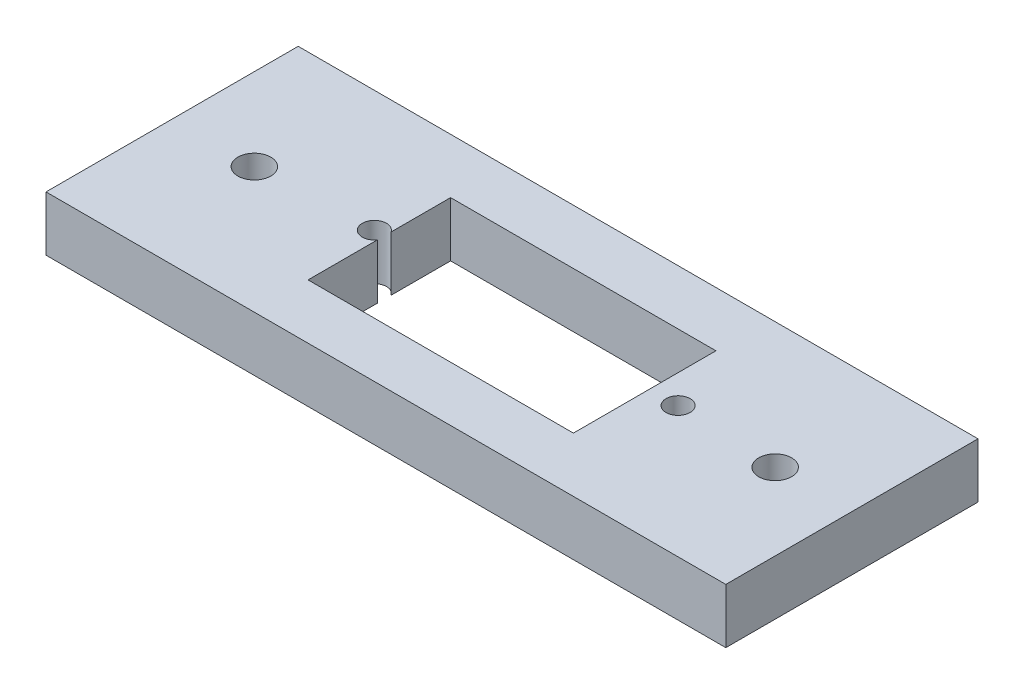
ISO-10303-21;
HEADER;
FILE_DESCRIPTION(('STEP AP214'),'2;1');
FILE_NAME('part.step','',(''),(''),'','','');
FILE_SCHEMA(('AUTOMOTIVE_DESIGN { 1 0 10303 214 1 1 1 1 }'));
ENDSEC;
DATA;
#1=APPLICATION_CONTEXT('core data for automotive mechanical design processes');
#2=APPLICATION_PROTOCOL_DEFINITION('international standard','automotive_design',2000,#1);
#3=PRODUCT_CONTEXT('',#1,'mechanical');
#4=PRODUCT('Part','Part','',(#3));
#5=PRODUCT_RELATED_PRODUCT_CATEGORY('part','',(#4));
#6=PRODUCT_DEFINITION_FORMATION('','',#4);
#7=PRODUCT_DEFINITION_CONTEXT('part definition',#1,'design');
#8=PRODUCT_DEFINITION('design','',#6,#7);
#9=PRODUCT_DEFINITION_SHAPE('','',#8);
#10=(LENGTH_UNIT() NAMED_UNIT(*) SI_UNIT(.MILLI.,.METRE.));
#11=(NAMED_UNIT(*) PLANE_ANGLE_UNIT() SI_UNIT($,.RADIAN.));
#12=(NAMED_UNIT(*) SI_UNIT($,.STERADIAN.) SOLID_ANGLE_UNIT());
#13=UNCERTAINTY_MEASURE_WITH_UNIT(LENGTH_MEASURE(1.E-05),#10,'distance_accuracy_value','');
#14=(GEOMETRIC_REPRESENTATION_CONTEXT(3) GLOBAL_UNCERTAINTY_ASSIGNED_CONTEXT((#13)) GLOBAL_UNIT_ASSIGNED_CONTEXT((#10,
#11,#12)) REPRESENTATION_CONTEXT('',''));
#15=CARTESIAN_POINT('',(0.,0.,0.));
#16=DIRECTION('',(0.,0.,1.));
#17=DIRECTION('',(1.,0.,0.));
#18=AXIS2_PLACEMENT_3D('',#15,#16,#17);
#19=CARTESIAN_POINT('',(18.9,5.,-18.));
#20=DIRECTION('',(1.,0.,0.));
#21=DIRECTION('',(0.,0.,-1.));
#22=AXIS2_PLACEMENT_3D('',#19,#20,#21);
#23=PLANE('',#22);
#24=DIRECTION('',(0.,1.,0.));
#25=VECTOR('',#24,1.);
#26=CARTESIAN_POINT('',(18.9,-5.,-12.5824555320338));
#27=LINE('',#26,#25);
#28=CARTESIAN_POINT('',(18.9,0.,-12.5824555320338));
#29=VERTEX_POINT('',#28);
#30=CARTESIAN_POINT('',(18.9,5.,-12.5824555320338));
#31=VERTEX_POINT('',#30);
#32=EDGE_CURVE('E11',#29,#31,#27,.T.);
#33=ORIENTED_EDGE('',*,*,#32,.F.);
#34=DIRECTION('',(0.,0.,1.));
#35=VECTOR('',#34,1.);
#36=CARTESIAN_POINT('',(18.9,0.,-18.));
#37=LINE('',#36,#35);
#38=CARTESIAN_POINT('',(18.9,0.,-18.));
#39=VERTEX_POINT('',#38);
#40=EDGE_CURVE('E162',#39,#29,#37,.T.);
#41=ORIENTED_EDGE('',*,*,#40,.F.);
#42=DIRECTION('',(0.,-1.,0.));
#43=VECTOR('',#42,1.);
#44=CARTESIAN_POINT('',(18.9,5.,-18.));
#45=LINE('',#44,#43);
#46=CARTESIAN_POINT('',(18.9,5.,-18.));
#47=VERTEX_POINT('',#46);
#48=EDGE_CURVE('E141',#47,#39,#45,.T.);
#49=ORIENTED_EDGE('',*,*,#48,.F.);
#50=DIRECTION('',(0.,0.,1.));
#51=VECTOR('',#50,1.);
#52=CARTESIAN_POINT('',(18.9,5.,-18.));
#53=LINE('',#52,#51);
#54=EDGE_CURVE('E134',#47,#31,#53,.T.);
#55=ORIENTED_EDGE('',*,*,#54,.T.);
#56=EDGE_LOOP('',(#33,#41,#49,#55));
#57=FACE_BOUND('',#56,.T.);
#58=ADVANCED_FACE('F45',(#57),#23,.T.);
#59=CARTESIAN_POINT('',(0.,5.,0.));
#60=DIRECTION('',(0.,-1.,0.));
#61=DIRECTION('',(0.,0.,-1.));
#62=AXIS2_PLACEMENT_3D('',#59,#60,#61);
#63=PLANE('',#62);
#64=CARTESIAN_POINT('',(55.,5.,-11.5));
#65=DIRECTION('',(0.,1.,0.));
#66=DIRECTION('',(0.,0.,1.));
#67=AXIS2_PLACEMENT_3D('',#64,#65,#66);
#68=CIRCLE('',#67,1.5);
#69=CARTESIAN_POINT('',(55.,5.,-9.99999999999999));
#70=VERTEX_POINT('',#69);
#71=EDGE_CURVE('E393',#70,#70,#68,.T.);
#72=ORIENTED_EDGE('',*,*,#71,.F.);
#73=EDGE_LOOP('',(#72));
#74=FACE_BOUND('',#73,.T.);
#75=CARTESIAN_POINT('',(7.5,5.,-11.5));
#76=DIRECTION('',(0.,1.,0.));
#77=DIRECTION('',(0.,0.,1.));
#78=AXIS2_PLACEMENT_3D('',#75,#76,#77);
#79=CIRCLE('',#78,1.5);
#80=CARTESIAN_POINT('',(7.5,5.,-10.));
#81=VERTEX_POINT('',#80);
#82=EDGE_CURVE('E138',#81,#81,#79,.T.);
#83=ORIENTED_EDGE('',*,*,#82,.F.);
#84=EDGE_LOOP('',(#83));
#85=FACE_BOUND('',#84,.T.);
#86=CARTESIAN_POINT('',(45.7000000000002,5.,-11.9499999999999));
#87=DIRECTION('',(0.,1.,0.));
#88=DIRECTION('',(0.,0.,1.));
#89=AXIS2_PLACEMENT_3D('',#86,#87,#88);
#90=CIRCLE('',#89,1.09999999999999);
#91=CARTESIAN_POINT('',(45.7000000000002,5.,-10.8499999999999));
#92=VERTEX_POINT('',#91);
#93=EDGE_CURVE('E137',#92,#92,#90,.T.);
#94=ORIENTED_EDGE('',*,*,#93,.F.);
#95=EDGE_LOOP('',(#94));
#96=FACE_BOUND('',#95,.T.);
#97=DIRECTION('',(0.,0.,1.));
#98=VECTOR('',#97,1.);
#99=CARTESIAN_POINT('',(0.,5.,0.));
#100=LINE('',#99,#98);
#101=CARTESIAN_POINT('',(0.,5.,-23.));
#102=VERTEX_POINT('',#101);
#103=CARTESIAN_POINT('',(0.,5.,0.));
#104=VERTEX_POINT('',#103);
#105=EDGE_CURVE('E183',#102,#104,#100,.T.);
#106=ORIENTED_EDGE('',*,*,#105,.T.);
#107=DIRECTION('',(1.,0.,0.));
#108=VECTOR('',#107,1.);
#109=CARTESIAN_POINT('',(0.,5.,0.));
#110=LINE('',#109,#108);
#111=CARTESIAN_POINT('',(62.,5.,0.));
#112=VERTEX_POINT('',#111);
#113=EDGE_CURVE('E187',#104,#112,#110,.T.);
#114=ORIENTED_EDGE('',*,*,#113,.T.);
#115=DIRECTION('',(0.,0.,-1.));
#116=VECTOR('',#115,1.);
#117=CARTESIAN_POINT('',(62.,5.,0.));
#118=LINE('',#117,#116);
#119=CARTESIAN_POINT('',(62.,5.,-23.));
#120=VERTEX_POINT('',#119);
#121=EDGE_CURVE('E191',#112,#120,#118,.T.);
#122=ORIENTED_EDGE('',*,*,#121,.T.);
#123=DIRECTION('',(-1.,0.,0.));
#124=VECTOR('',#123,1.);
#125=CARTESIAN_POINT('',(0.,5.,-23.));
#126=LINE('',#125,#124);
#127=EDGE_CURVE('E194',#120,#102,#126,.T.);
#128=ORIENTED_EDGE('',*,*,#127,.T.);
#129=EDGE_LOOP('',(#106,#114,#122,#128));
#130=FACE_BOUND('',#129,.T.);
#131=CARTESIAN_POINT('',(18.9,5.,-11.317544467966));
#132=VERTEX_POINT('',#131);
#133=CARTESIAN_POINT('',(18.9,5.,-5.));
#134=VERTEX_POINT('',#133);
#135=EDGE_CURVE('E69',#132,#134,#53,.T.);
#136=ORIENTED_EDGE('',*,*,#135,.F.);
#137=CARTESIAN_POINT('',(18.0000000000002,5.,-11.9499999999999));
#138=DIRECTION('',(0.,1.,0.));
#139=DIRECTION('',(0.,0.,1.));
#140=AXIS2_PLACEMENT_3D('',#137,#138,#139);
#141=CIRCLE('',#140,1.1);
#142=EDGE_CURVE('E62',#31,#132,#141,.T.);
#143=ORIENTED_EDGE('',*,*,#142,.F.);
#144=ORIENTED_EDGE('',*,*,#54,.F.);
#145=DIRECTION('',(-1.,0.,0.));
#146=VECTOR('',#145,1.);
#147=CARTESIAN_POINT('',(18.9,5.,-18.));
#148=LINE('',#147,#146);
#149=CARTESIAN_POINT('',(43.1,5.,-18.));
#150=VERTEX_POINT('',#149);
#151=EDGE_CURVE('E149',#150,#47,#148,.T.);
#152=ORIENTED_EDGE('',*,*,#151,.F.);
#153=DIRECTION('',(0.,0.,-1.));
#154=VECTOR('',#153,1.);
#155=CARTESIAN_POINT('',(43.1,5.,-18.));
#156=LINE('',#155,#154);
#157=CARTESIAN_POINT('',(43.1,5.,-5.));
#158=VERTEX_POINT('',#157);
#159=EDGE_CURVE('E169',#158,#150,#156,.T.);
#160=ORIENTED_EDGE('',*,*,#159,.F.);
#161=DIRECTION('',(1.,0.,0.));
#162=VECTOR('',#161,1.);
#163=CARTESIAN_POINT('',(18.9,5.,-5.));
#164=LINE('',#163,#162);
#165=EDGE_CURVE('E143',#134,#158,#164,.T.);
#166=ORIENTED_EDGE('',*,*,#165,.F.);
#167=EDGE_LOOP('',(#136,#143,#144,#152,#160,#166));
#168=FACE_BOUND('',#167,.T.);
#169=ADVANCED_FACE('F132',(#74,#85,#96,#130,#168),#63,.F.);
#170=CARTESIAN_POINT('',(0.,0.,0.));
#171=DIRECTION('',(0.,-1.,0.));
#172=DIRECTION('',(0.,0.,-1.));
#173=AXIS2_PLACEMENT_3D('',#170,#171,#172);
#174=PLANE('',#173);
#175=CARTESIAN_POINT('',(55.,0.,-11.5));
#176=DIRECTION('',(0.,-1.,0.));
#177=DIRECTION('',(0.,0.,-1.));
#178=AXIS2_PLACEMENT_3D('',#175,#176,#177);
#179=CIRCLE('',#178,1.5);
#180=CARTESIAN_POINT('',(55.,0.,-13.));
#181=VERTEX_POINT('',#180);
#182=EDGE_CURVE('E49',#181,#181,#179,.T.);
#183=ORIENTED_EDGE('',*,*,#182,.F.);
#184=EDGE_LOOP('',(#183));
#185=FACE_BOUND('',#184,.T.);
#186=CARTESIAN_POINT('',(7.5,0.,-11.5));
#187=DIRECTION('',(0.,-1.,0.));
#188=DIRECTION('',(0.,0.,-1.));
#189=AXIS2_PLACEMENT_3D('',#186,#187,#188);
#190=CIRCLE('',#189,1.5);
#191=CARTESIAN_POINT('',(7.5,0.,-13.));
#192=VERTEX_POINT('',#191);
#193=EDGE_CURVE('E229',#192,#192,#190,.T.);
#194=ORIENTED_EDGE('',*,*,#193,.F.);
#195=EDGE_LOOP('',(#194));
#196=FACE_BOUND('',#195,.T.);
#197=CARTESIAN_POINT('',(18.0000000000002,0.,-11.9499999999999));
#198=DIRECTION('',(0.,-1.,0.));
#199=DIRECTION('',(0.,0.,-1.));
#200=AXIS2_PLACEMENT_3D('',#197,#198,#199);
#201=CIRCLE('',#200,1.1);
#202=CARTESIAN_POINT('',(18.9,0.,-11.317544467966));
#203=VERTEX_POINT('',#202);
#204=EDGE_CURVE('E125',#203,#29,#201,.T.);
#205=ORIENTED_EDGE('',*,*,#204,.F.);
#206=CARTESIAN_POINT('',(18.9,0.,-5.));
#207=VERTEX_POINT('',#206);
#208=EDGE_CURVE('E161',#203,#207,#37,.T.);
#209=ORIENTED_EDGE('',*,*,#208,.T.);
#210=DIRECTION('',(1.,0.,0.));
#211=VECTOR('',#210,1.);
#212=CARTESIAN_POINT('',(18.9,0.,-5.));
#213=LINE('',#212,#211);
#214=CARTESIAN_POINT('',(43.1,0.,-5.));
#215=VERTEX_POINT('',#214);
#216=EDGE_CURVE('E165',#207,#215,#213,.T.);
#217=ORIENTED_EDGE('',*,*,#216,.T.);
#218=DIRECTION('',(0.,0.,-1.));
#219=VECTOR('',#218,1.);
#220=CARTESIAN_POINT('',(43.1,0.,-18.));
#221=LINE('',#220,#219);
#222=CARTESIAN_POINT('',(43.1,0.,-18.));
#223=VERTEX_POINT('',#222);
#224=EDGE_CURVE('E153',#215,#223,#221,.T.);
#225=ORIENTED_EDGE('',*,*,#224,.T.);
#226=DIRECTION('',(-1.,0.,0.));
#227=VECTOR('',#226,1.);
#228=CARTESIAN_POINT('',(18.9,0.,-18.));
#229=LINE('',#228,#227);
#230=EDGE_CURVE('E157',#223,#39,#229,.T.);
#231=ORIENTED_EDGE('',*,*,#230,.T.);
#232=ORIENTED_EDGE('',*,*,#40,.T.);
#233=EDGE_LOOP('',(#205,#209,#217,#225,#231,#232));
#234=FACE_BOUND('',#233,.T.);
#235=CARTESIAN_POINT('',(45.7000000000002,0.,-11.9499999999999));
#236=DIRECTION('',(0.,-1.,0.));
#237=DIRECTION('',(0.,0.,-1.));
#238=AXIS2_PLACEMENT_3D('',#235,#236,#237);
#239=CIRCLE('',#238,1.09999999999999);
#240=CARTESIAN_POINT('',(45.7000000000002,0.,-13.0499999999999));
#241=VERTEX_POINT('',#240);
#242=EDGE_CURVE('E226',#241,#241,#239,.T.);
#243=ORIENTED_EDGE('',*,*,#242,.F.);
#244=EDGE_LOOP('',(#243));
#245=FACE_BOUND('',#244,.T.);
#246=DIRECTION('',(0.,0.,1.));
#247=VECTOR('',#246,1.);
#248=CARTESIAN_POINT('',(0.,0.,0.));
#249=LINE('',#248,#247);
#250=CARTESIAN_POINT('',(0.,0.,-23.));
#251=VERTEX_POINT('',#250);
#252=CARTESIAN_POINT('',(0.,0.,0.));
#253=VERTEX_POINT('',#252);
#254=EDGE_CURVE('E182',#251,#253,#249,.T.);
#255=ORIENTED_EDGE('',*,*,#254,.F.);
#256=DIRECTION('',(-1.,0.,0.));
#257=VECTOR('',#256,1.);
#258=CARTESIAN_POINT('',(0.,0.,-23.));
#259=LINE('',#258,#257);
#260=CARTESIAN_POINT('',(62.,0.,-23.));
#261=VERTEX_POINT('',#260);
#262=EDGE_CURVE('E188',#261,#251,#259,.T.);
#263=ORIENTED_EDGE('',*,*,#262,.F.);
#264=DIRECTION('',(0.,0.,-1.));
#265=VECTOR('',#264,1.);
#266=CARTESIAN_POINT('',(62.,0.,0.));
#267=LINE('',#266,#265);
#268=CARTESIAN_POINT('',(62.,0.,0.));
#269=VERTEX_POINT('',#268);
#270=EDGE_CURVE('E204',#269,#261,#267,.T.);
#271=ORIENTED_EDGE('',*,*,#270,.F.);
#272=DIRECTION('',(1.,0.,0.));
#273=VECTOR('',#272,1.);
#274=CARTESIAN_POINT('',(0.,0.,0.));
#275=LINE('',#274,#273);
#276=EDGE_CURVE('E201',#253,#269,#275,.T.);
#277=ORIENTED_EDGE('',*,*,#276,.F.);
#278=EDGE_LOOP('',(#255,#263,#271,#277));
#279=FACE_BOUND('',#278,.T.);
#280=ADVANCED_FACE('F241',(#185,#196,#234,#245,#279),#174,.T.);
#281=CARTESIAN_POINT('',(0.,5.,0.));
#282=DIRECTION('',(1.,0.,0.));
#283=DIRECTION('',(0.,0.,-1.));
#284=AXIS2_PLACEMENT_3D('',#281,#282,#283);
#285=PLANE('',#284);
#286=ORIENTED_EDGE('',*,*,#254,.T.);
#287=DIRECTION('',(0.,-1.,0.));
#288=VECTOR('',#287,1.);
#289=CARTESIAN_POINT('',(0.,5.,0.));
#290=LINE('',#289,#288);
#291=EDGE_CURVE('E220',#104,#253,#290,.T.);
#292=ORIENTED_EDGE('',*,*,#291,.F.);
#293=ORIENTED_EDGE('',*,*,#105,.F.);
#294=DIRECTION('',(0.,-1.,0.));
#295=VECTOR('',#294,1.);
#296=CARTESIAN_POINT('',(0.,5.,-23.));
#297=LINE('',#296,#295);
#298=EDGE_CURVE('E197',#102,#251,#297,.T.);
#299=ORIENTED_EDGE('',*,*,#298,.T.);
#300=EDGE_LOOP('',(#286,#292,#293,#299));
#301=FACE_BOUND('',#300,.T.);
#302=ADVANCED_FACE('F47',(#301),#285,.F.);
#303=CARTESIAN_POINT('',(0.,5.,0.));
#304=DIRECTION('',(0.,0.,-1.));
#305=DIRECTION('',(-1.,0.,0.));
#306=AXIS2_PLACEMENT_3D('',#303,#304,#305);
#307=PLANE('',#306);
#308=ORIENTED_EDGE('',*,*,#276,.T.);
#309=DIRECTION('',(0.,-1.,0.));
#310=VECTOR('',#309,1.);
#311=CARTESIAN_POINT('',(62.,5.,0.));
#312=LINE('',#311,#310);
#313=EDGE_CURVE('E216',#112,#269,#312,.T.);
#314=ORIENTED_EDGE('',*,*,#313,.F.);
#315=ORIENTED_EDGE('',*,*,#113,.F.);
#316=ORIENTED_EDGE('',*,*,#291,.T.);
#317=EDGE_LOOP('',(#308,#314,#315,#316));
#318=FACE_BOUND('',#317,.T.);
#319=ADVANCED_FACE('F266',(#318),#307,.F.);
#320=CARTESIAN_POINT('',(62.,5.,0.));
#321=DIRECTION('',(-1.,0.,0.));
#322=DIRECTION('',(0.,0.,1.));
#323=AXIS2_PLACEMENT_3D('',#320,#321,#322);
#324=PLANE('',#323);
#325=ORIENTED_EDGE('',*,*,#270,.T.);
#326=DIRECTION('',(0.,-1.,0.));
#327=VECTOR('',#326,1.);
#328=CARTESIAN_POINT('',(62.,5.,-23.));
#329=LINE('',#328,#327);
#330=EDGE_CURVE('E212',#120,#261,#329,.T.);
#331=ORIENTED_EDGE('',*,*,#330,.F.);
#332=ORIENTED_EDGE('',*,*,#121,.F.);
#333=ORIENTED_EDGE('',*,*,#313,.T.);
#334=EDGE_LOOP('',(#325,#331,#332,#333));
#335=FACE_BOUND('',#334,.T.);
#336=ADVANCED_FACE('F263',(#335),#324,.F.);
#337=CARTESIAN_POINT('',(0.,5.,-23.));
#338=DIRECTION('',(0.,0.,1.));
#339=DIRECTION('',(1.,0.,0.));
#340=AXIS2_PLACEMENT_3D('',#337,#338,#339);
#341=PLANE('',#340);
#342=ORIENTED_EDGE('',*,*,#262,.T.);
#343=ORIENTED_EDGE('',*,*,#298,.F.);
#344=ORIENTED_EDGE('',*,*,#127,.F.);
#345=ORIENTED_EDGE('',*,*,#330,.T.);
#346=EDGE_LOOP('',(#342,#343,#344,#345));
#347=FACE_BOUND('',#346,.T.);
#348=ADVANCED_FACE('F259',(#347),#341,.F.);
#349=CARTESIAN_POINT('',(43.1,5.,-18.));
#350=DIRECTION('',(-1.,0.,0.));
#351=DIRECTION('',(0.,0.,1.));
#352=AXIS2_PLACEMENT_3D('',#349,#350,#351);
#353=PLANE('',#352);
#354=ORIENTED_EDGE('',*,*,#224,.F.);
#355=DIRECTION('',(0.,-1.,0.));
#356=VECTOR('',#355,1.);
#357=CARTESIAN_POINT('',(43.1,5.,-5.));
#358=LINE('',#357,#356);
#359=EDGE_CURVE('E147',#158,#215,#358,.T.);
#360=ORIENTED_EDGE('',*,*,#359,.F.);
#361=ORIENTED_EDGE('',*,*,#159,.T.);
#362=DIRECTION('',(0.,-1.,0.));
#363=VECTOR('',#362,1.);
#364=CARTESIAN_POINT('',(43.1,5.,-18.));
#365=LINE('',#364,#363);
#366=EDGE_CURVE('E178',#150,#223,#365,.T.);
#367=ORIENTED_EDGE('',*,*,#366,.T.);
#368=EDGE_LOOP('',(#354,#360,#361,#367));
#369=FACE_BOUND('',#368,.T.);
#370=ADVANCED_FACE('F279',(#369),#353,.T.);
#371=CARTESIAN_POINT('',(18.9,5.,-18.));
#372=DIRECTION('',(0.,0.,1.));
#373=DIRECTION('',(1.,0.,0.));
#374=AXIS2_PLACEMENT_3D('',#371,#372,#373);
#375=PLANE('',#374);
#376=ORIENTED_EDGE('',*,*,#230,.F.);
#377=ORIENTED_EDGE('',*,*,#366,.F.);
#378=ORIENTED_EDGE('',*,*,#151,.T.);
#379=ORIENTED_EDGE('',*,*,#48,.T.);
#380=EDGE_LOOP('',(#376,#377,#378,#379));
#381=FACE_BOUND('',#380,.T.);
#382=ADVANCED_FACE('F321',(#381),#375,.T.);
#383=DIRECTION('',(0.,1.,0.));
#384=VECTOR('',#383,1.);
#385=CARTESIAN_POINT('',(18.9,-5.,-11.317544467966));
#386=LINE('',#385,#384);
#387=EDGE_CURVE('E55',#132,#203,#386,.F.);
#388=ORIENTED_EDGE('',*,*,#387,.F.);
#389=ORIENTED_EDGE('',*,*,#135,.T.);
#390=DIRECTION('',(0.,-1.,0.));
#391=VECTOR('',#390,1.);
#392=CARTESIAN_POINT('',(18.9,5.,-5.));
#393=LINE('',#392,#391);
#394=EDGE_CURVE('E173',#134,#207,#393,.T.);
#395=ORIENTED_EDGE('',*,*,#394,.T.);
#396=ORIENTED_EDGE('',*,*,#208,.F.);
#397=EDGE_LOOP('',(#388,#389,#395,#396));
#398=FACE_BOUND('',#397,.T.);
#399=ADVANCED_FACE('F275',(#398),#23,.T.);
#400=CARTESIAN_POINT('',(18.9,5.,-5.));
#401=DIRECTION('',(0.,0.,-1.));
#402=DIRECTION('',(-1.,0.,0.));
#403=AXIS2_PLACEMENT_3D('',#400,#401,#402);
#404=PLANE('',#403);
#405=ORIENTED_EDGE('',*,*,#216,.F.);
#406=ORIENTED_EDGE('',*,*,#394,.F.);
#407=ORIENTED_EDGE('',*,*,#165,.T.);
#408=ORIENTED_EDGE('',*,*,#359,.T.);
#409=EDGE_LOOP('',(#405,#406,#407,#408));
#410=FACE_BOUND('',#409,.T.);
#411=ADVANCED_FACE('F339',(#410),#404,.T.);
#412=CARTESIAN_POINT('',(18.0000000000002,-5.,-11.9499999999999));
#413=DIRECTION('',(0.,1.,0.));
#414=DIRECTION('',(0.,0.,1.));
#415=AXIS2_PLACEMENT_3D('',#412,#413,#414);
#416=CYLINDRICAL_SURFACE('',#415,1.1);
#417=ORIENTED_EDGE('',*,*,#32,.T.);
#418=ORIENTED_EDGE('',*,*,#142,.T.);
#419=ORIENTED_EDGE('',*,*,#387,.T.);
#420=ORIENTED_EDGE('',*,*,#204,.T.);
#421=EDGE_LOOP('',(#417,#418,#419,#420));
#422=FACE_BOUND('',#421,.T.);
#423=ADVANCED_FACE('F123',(#422),#416,.F.);
#424=CARTESIAN_POINT('',(45.7000000000002,-5.,-11.9499999999999));
#425=DIRECTION('',(0.,1.,0.));
#426=DIRECTION('',(0.,0.,1.));
#427=AXIS2_PLACEMENT_3D('',#424,#425,#426);
#428=CYLINDRICAL_SURFACE('',#427,1.09999999999999);
#429=ORIENTED_EDGE('',*,*,#242,.T.);
#430=EDGE_LOOP('',(#429));
#431=FACE_BOUND('',#430,.T.);
#432=ORIENTED_EDGE('',*,*,#93,.T.);
#433=EDGE_LOOP('',(#432));
#434=FACE_BOUND('',#433,.T.);
#435=ADVANCED_FACE('F360',(#431,#434),#428,.F.);
#436=CARTESIAN_POINT('',(7.5,-5.,-11.5));
#437=DIRECTION('',(0.,1.,0.));
#438=DIRECTION('',(0.,0.,1.));
#439=AXIS2_PLACEMENT_3D('',#436,#437,#438);
#440=CYLINDRICAL_SURFACE('',#439,1.5);
#441=ORIENTED_EDGE('',*,*,#193,.T.);
#442=EDGE_LOOP('',(#441));
#443=FACE_BOUND('',#442,.T.);
#444=ORIENTED_EDGE('',*,*,#82,.T.);
#445=EDGE_LOOP('',(#444));
#446=FACE_BOUND('',#445,.T.);
#447=ADVANCED_FACE('F369',(#443,#446),#440,.F.);
#448=CARTESIAN_POINT('',(55.,-5.,-11.5));
#449=DIRECTION('',(0.,1.,0.));
#450=DIRECTION('',(0.,0.,1.));
#451=AXIS2_PLACEMENT_3D('',#448,#449,#450);
#452=CYLINDRICAL_SURFACE('',#451,1.5);
#453=ORIENTED_EDGE('',*,*,#182,.T.);
#454=EDGE_LOOP('',(#453));
#455=FACE_BOUND('',#454,.T.);
#456=ORIENTED_EDGE('',*,*,#71,.T.);
#457=EDGE_LOOP('',(#456));
#458=FACE_BOUND('',#457,.T.);
#459=ADVANCED_FACE('F238',(#455,#458),#452,.F.);
#460=CLOSED_SHELL('',(#58,#169,#280,#302,#319,#336,#348,#370,#382,#399,#411,#423,#435,#447,#459));
#461=MANIFOLD_SOLID_BREP('B2',#460);
#462=ADVANCED_BREP_SHAPE_REPRESENTATION('',(#18,#461),#14);
#463=SHAPE_DEFINITION_REPRESENTATION(#9,#462);
ENDSEC;
END-ISO-10303-21;
